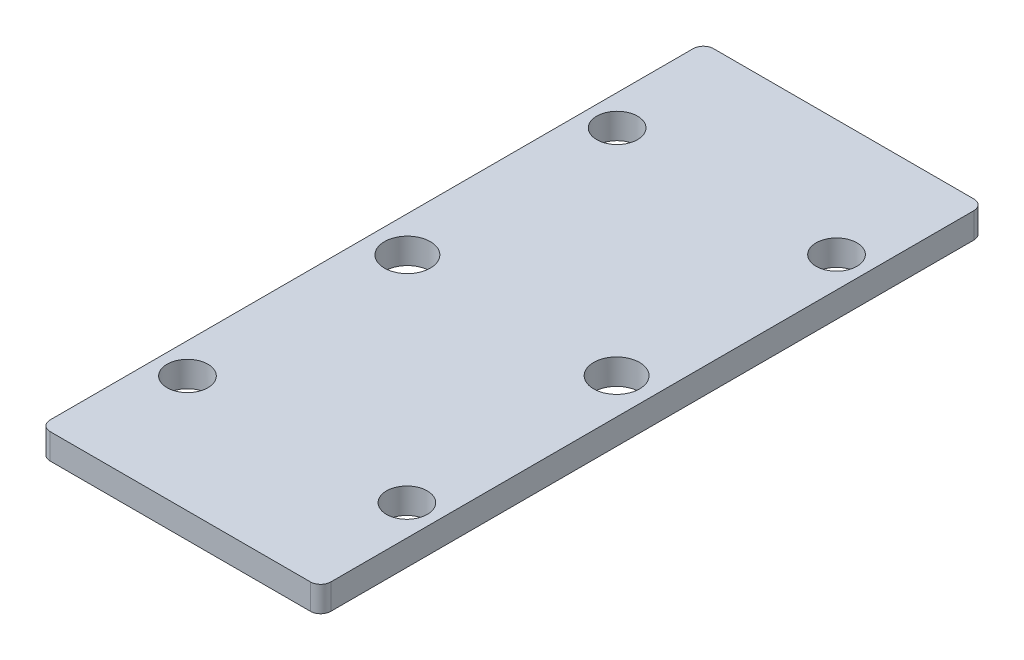
ISO-10303-21;
HEADER;
FILE_DESCRIPTION(('STEP AP214'),'2;1');
FILE_NAME('part.step','',(''),(''),'','','');
FILE_SCHEMA(('AUTOMOTIVE_DESIGN { 1 0 10303 214 1 1 1 1 }'));
ENDSEC;
DATA;
#1=APPLICATION_CONTEXT('core data for automotive mechanical design processes');
#2=APPLICATION_PROTOCOL_DEFINITION('international standard','automotive_design',2000,#1);
#3=PRODUCT_CONTEXT('',#1,'mechanical');
#4=PRODUCT('Part','Part','',(#3));
#5=PRODUCT_RELATED_PRODUCT_CATEGORY('part','',(#4));
#6=PRODUCT_DEFINITION_FORMATION('','',#4);
#7=PRODUCT_DEFINITION_CONTEXT('part definition',#1,'design');
#8=PRODUCT_DEFINITION('design','',#6,#7);
#9=PRODUCT_DEFINITION_SHAPE('','',#8);
#10=(LENGTH_UNIT() NAMED_UNIT(*) SI_UNIT(.MILLI.,.METRE.));
#11=(NAMED_UNIT(*) PLANE_ANGLE_UNIT() SI_UNIT($,.RADIAN.));
#12=(NAMED_UNIT(*) SI_UNIT($,.STERADIAN.) SOLID_ANGLE_UNIT());
#13=UNCERTAINTY_MEASURE_WITH_UNIT(LENGTH_MEASURE(1.E-05),#10,'distance_accuracy_value','');
#14=(GEOMETRIC_REPRESENTATION_CONTEXT(3) GLOBAL_UNCERTAINTY_ASSIGNED_CONTEXT((#13)) GLOBAL_UNIT_ASSIGNED_CONTEXT((#10,
#11,#12)) REPRESENTATION_CONTEXT('',''));
#15=CARTESIAN_POINT('',(0.,0.,0.));
#16=DIRECTION('',(0.,0.,1.));
#17=DIRECTION('',(1.,0.,0.));
#18=AXIS2_PLACEMENT_3D('',#15,#16,#17);
#19=CARTESIAN_POINT('',(25.5,5.,63.));
#20=DIRECTION('',(0.,-1.,0.));
#21=DIRECTION('',(0.,0.,-1.));
#22=AXIS2_PLACEMENT_3D('',#19,#20,#21);
#23=CYLINDRICAL_SURFACE('',#22,1.99999999999999);
#24=CARTESIAN_POINT('',(25.5,0.,63.));
#25=DIRECTION('',(0.,1.,0.));
#26=DIRECTION('',(0.,0.,1.));
#27=AXIS2_PLACEMENT_3D('',#24,#25,#26);
#28=CIRCLE('',#27,1.99999999999999);
#29=CARTESIAN_POINT('',(25.5,0.,65.));
#30=VERTEX_POINT('',#29);
#31=CARTESIAN_POINT('',(27.5,0.,63.));
#32=VERTEX_POINT('',#31);
#33=EDGE_CURVE('E130',#30,#32,#28,.T.);
#34=ORIENTED_EDGE('',*,*,#33,.T.);
#35=DIRECTION('',(0.,-1.,0.));
#36=VECTOR('',#35,1.);
#37=CARTESIAN_POINT('',(27.5,5.,63.));
#38=LINE('',#37,#36);
#39=CARTESIAN_POINT('',(27.5,5.,63.));
#40=VERTEX_POINT('',#39);
#41=EDGE_CURVE('E11',#40,#32,#38,.T.);
#42=ORIENTED_EDGE('',*,*,#41,.F.);
#43=CARTESIAN_POINT('',(25.5,5.,63.));
#44=DIRECTION('',(0.,1.,0.));
#45=DIRECTION('',(0.,0.,1.));
#46=AXIS2_PLACEMENT_3D('',#43,#44,#45);
#47=CIRCLE('',#46,1.99999999999999);
#48=CARTESIAN_POINT('',(25.5,5.,65.));
#49=VERTEX_POINT('',#48);
#50=EDGE_CURVE('E144',#49,#40,#47,.T.);
#51=ORIENTED_EDGE('',*,*,#50,.F.);
#52=DIRECTION('',(0.,-1.,0.));
#53=VECTOR('',#52,1.);
#54=CARTESIAN_POINT('',(25.5,5.,65.));
#55=LINE('',#54,#53);
#56=EDGE_CURVE('E126',#49,#30,#55,.T.);
#57=ORIENTED_EDGE('',*,*,#56,.T.);
#58=EDGE_LOOP('',(#34,#42,#51,#57));
#59=FACE_BOUND('',#58,.T.);
#60=ADVANCED_FACE('F32',(#59),#23,.T.);
#61=CARTESIAN_POINT('',(27.5,5.,-63.));
#62=DIRECTION('',(-1.,0.,0.));
#63=DIRECTION('',(0.,0.,1.));
#64=AXIS2_PLACEMENT_3D('',#61,#62,#63);
#65=PLANE('',#64);
#66=DIRECTION('',(0.,0.,-1.));
#67=VECTOR('',#66,1.);
#68=CARTESIAN_POINT('',(27.5,0.,-63.));
#69=LINE('',#68,#67);
#70=CARTESIAN_POINT('',(27.5,0.,-63.));
#71=VERTEX_POINT('',#70);
#72=EDGE_CURVE('E133',#32,#71,#69,.T.);
#73=ORIENTED_EDGE('',*,*,#72,.T.);
#74=DIRECTION('',(0.,-1.,0.));
#75=VECTOR('',#74,1.);
#76=CARTESIAN_POINT('',(27.5,5.,-63.));
#77=LINE('',#76,#75);
#78=CARTESIAN_POINT('',(27.5,5.,-63.));
#79=VERTEX_POINT('',#78);
#80=EDGE_CURVE('E41',#79,#71,#77,.T.);
#81=ORIENTED_EDGE('',*,*,#80,.F.);
#82=DIRECTION('',(0.,0.,-1.));
#83=VECTOR('',#82,1.);
#84=CARTESIAN_POINT('',(27.5,5.,-63.));
#85=LINE('',#84,#83);
#86=EDGE_CURVE('E93',#40,#79,#85,.T.);
#87=ORIENTED_EDGE('',*,*,#86,.F.);
#88=ORIENTED_EDGE('',*,*,#41,.T.);
#89=EDGE_LOOP('',(#73,#81,#87,#88));
#90=FACE_BOUND('',#89,.T.);
#91=ADVANCED_FACE('F191',(#90),#65,.F.);
#92=CARTESIAN_POINT('',(25.5,5.,-63.));
#93=DIRECTION('',(0.,-1.,0.));
#94=DIRECTION('',(0.,0.,-1.));
#95=AXIS2_PLACEMENT_3D('',#92,#93,#94);
#96=CYLINDRICAL_SURFACE('',#95,1.99999999999999);
#97=CARTESIAN_POINT('',(25.5,0.,-63.));
#98=DIRECTION('',(0.,1.,0.));
#99=DIRECTION('',(0.,0.,-1.));
#100=AXIS2_PLACEMENT_3D('',#97,#98,#99);
#101=CIRCLE('',#100,1.99999999999999);
#102=CARTESIAN_POINT('',(25.5,0.,-65.));
#103=VERTEX_POINT('',#102);
#104=EDGE_CURVE('E135',#71,#103,#101,.T.);
#105=ORIENTED_EDGE('',*,*,#104,.T.);
#106=DIRECTION('',(0.,-1.,0.));
#107=VECTOR('',#106,1.);
#108=CARTESIAN_POINT('',(25.5,5.,-65.));
#109=LINE('',#108,#107);
#110=CARTESIAN_POINT('',(25.5,5.,-65.));
#111=VERTEX_POINT('',#110);
#112=EDGE_CURVE('E151',#111,#103,#109,.T.);
#113=ORIENTED_EDGE('',*,*,#112,.F.);
#114=CARTESIAN_POINT('',(25.5,5.,-63.));
#115=DIRECTION('',(0.,1.,0.));
#116=DIRECTION('',(0.,0.,-1.));
#117=AXIS2_PLACEMENT_3D('',#114,#115,#116);
#118=CIRCLE('',#117,1.99999999999999);
#119=EDGE_CURVE('E206',#79,#111,#118,.T.);
#120=ORIENTED_EDGE('',*,*,#119,.F.);
#121=ORIENTED_EDGE('',*,*,#80,.T.);
#122=EDGE_LOOP('',(#105,#113,#120,#121));
#123=FACE_BOUND('',#122,.T.);
#124=ADVANCED_FACE('F196',(#123),#96,.T.);
#125=CARTESIAN_POINT('',(-25.5,5.,-65.));
#126=DIRECTION('',(0.,0.,1.));
#127=DIRECTION('',(1.,0.,0.));
#128=AXIS2_PLACEMENT_3D('',#125,#126,#127);
#129=PLANE('',#128);
#130=DIRECTION('',(-1.,0.,0.));
#131=VECTOR('',#130,1.);
#132=CARTESIAN_POINT('',(-25.5,0.,-65.));
#133=LINE('',#132,#131);
#134=CARTESIAN_POINT('',(-25.5,0.,-65.));
#135=VERTEX_POINT('',#134);
#136=EDGE_CURVE('E137',#103,#135,#133,.T.);
#137=ORIENTED_EDGE('',*,*,#136,.T.);
#138=DIRECTION('',(0.,-1.,0.));
#139=VECTOR('',#138,1.);
#140=CARTESIAN_POINT('',(-25.5,5.,-65.));
#141=LINE('',#140,#139);
#142=CARTESIAN_POINT('',(-25.5,5.,-65.));
#143=VERTEX_POINT('',#142);
#144=EDGE_CURVE('E148',#143,#135,#141,.T.);
#145=ORIENTED_EDGE('',*,*,#144,.F.);
#146=DIRECTION('',(-1.,0.,0.));
#147=VECTOR('',#146,1.);
#148=CARTESIAN_POINT('',(-25.5,5.,-65.));
#149=LINE('',#148,#147);
#150=EDGE_CURVE('E208',#111,#143,#149,.T.);
#151=ORIENTED_EDGE('',*,*,#150,.F.);
#152=ORIENTED_EDGE('',*,*,#112,.T.);
#153=EDGE_LOOP('',(#137,#145,#151,#152));
#154=FACE_BOUND('',#153,.T.);
#155=ADVANCED_FACE('F261',(#154),#129,.F.);
#156=CARTESIAN_POINT('',(-25.5,5.,-63.));
#157=DIRECTION('',(0.,-1.,0.));
#158=DIRECTION('',(0.,0.,-1.));
#159=AXIS2_PLACEMENT_3D('',#156,#157,#158);
#160=CYLINDRICAL_SURFACE('',#159,1.99999999999999);
#161=CARTESIAN_POINT('',(-25.5,0.,-63.));
#162=DIRECTION('',(0.,1.,0.));
#163=DIRECTION('',(0.,0.,-1.));
#164=AXIS2_PLACEMENT_3D('',#161,#162,#163);
#165=CIRCLE('',#164,1.99999999999999);
#166=CARTESIAN_POINT('',(-27.5,0.,-63.));
#167=VERTEX_POINT('',#166);
#168=EDGE_CURVE('E139',#135,#167,#165,.T.);
#169=ORIENTED_EDGE('',*,*,#168,.T.);
#170=DIRECTION('',(0.,-1.,0.));
#171=VECTOR('',#170,1.);
#172=CARTESIAN_POINT('',(-27.5,5.,-63.));
#173=LINE('',#172,#171);
#174=CARTESIAN_POINT('',(-27.5,5.,-63.));
#175=VERTEX_POINT('',#174);
#176=EDGE_CURVE('E121',#175,#167,#173,.T.);
#177=ORIENTED_EDGE('',*,*,#176,.F.);
#178=CARTESIAN_POINT('',(-25.5,5.,-63.));
#179=DIRECTION('',(0.,1.,0.));
#180=DIRECTION('',(0.,0.,-1.));
#181=AXIS2_PLACEMENT_3D('',#178,#179,#180);
#182=CIRCLE('',#181,1.99999999999999);
#183=EDGE_CURVE('E112',#143,#175,#182,.T.);
#184=ORIENTED_EDGE('',*,*,#183,.F.);
#185=ORIENTED_EDGE('',*,*,#144,.T.);
#186=EDGE_LOOP('',(#169,#177,#184,#185));
#187=FACE_BOUND('',#186,.T.);
#188=ADVANCED_FACE('F258',(#187),#160,.T.);
#189=CARTESIAN_POINT('',(-27.5,5.,63.));
#190=DIRECTION('',(1.,0.,0.));
#191=DIRECTION('',(0.,0.,-1.));
#192=AXIS2_PLACEMENT_3D('',#189,#190,#191);
#193=PLANE('',#192);
#194=DIRECTION('',(0.,0.,1.));
#195=VECTOR('',#194,1.);
#196=CARTESIAN_POINT('',(-27.5,0.,63.));
#197=LINE('',#196,#195);
#198=CARTESIAN_POINT('',(-27.5,0.,63.));
#199=VERTEX_POINT('',#198);
#200=EDGE_CURVE('E120',#167,#199,#197,.T.);
#201=ORIENTED_EDGE('',*,*,#200,.T.);
#202=DIRECTION('',(0.,-1.,0.));
#203=VECTOR('',#202,1.);
#204=CARTESIAN_POINT('',(-27.5,5.,63.));
#205=LINE('',#204,#203);
#206=CARTESIAN_POINT('',(-27.5,5.,63.));
#207=VERTEX_POINT('',#206);
#208=EDGE_CURVE('E117',#207,#199,#205,.T.);
#209=ORIENTED_EDGE('',*,*,#208,.F.);
#210=DIRECTION('',(0.,0.,1.));
#211=VECTOR('',#210,1.);
#212=CARTESIAN_POINT('',(-27.5,5.,63.));
#213=LINE('',#212,#211);
#214=EDGE_CURVE('E106',#175,#207,#213,.T.);
#215=ORIENTED_EDGE('',*,*,#214,.F.);
#216=ORIENTED_EDGE('',*,*,#176,.T.);
#217=EDGE_LOOP('',(#201,#209,#215,#216));
#218=FACE_BOUND('',#217,.T.);
#219=ADVANCED_FACE('F118',(#218),#193,.F.);
#220=CARTESIAN_POINT('',(-25.5,5.,63.));
#221=DIRECTION('',(0.,-1.,0.));
#222=DIRECTION('',(0.,0.,-1.));
#223=AXIS2_PLACEMENT_3D('',#220,#221,#222);
#224=CYLINDRICAL_SURFACE('',#223,1.99999999999999);
#225=CARTESIAN_POINT('',(-25.5,0.,63.));
#226=DIRECTION('',(0.,1.,0.));
#227=DIRECTION('',(0.,0.,-1.));
#228=AXIS2_PLACEMENT_3D('',#225,#226,#227);
#229=CIRCLE('',#228,1.99999999999999);
#230=CARTESIAN_POINT('',(-25.5,0.,65.));
#231=VERTEX_POINT('',#230);
#232=EDGE_CURVE('E79',#199,#231,#229,.T.);
#233=ORIENTED_EDGE('',*,*,#232,.T.);
#234=DIRECTION('',(0.,-1.,0.));
#235=VECTOR('',#234,1.);
#236=CARTESIAN_POINT('',(-25.5,5.,65.));
#237=LINE('',#236,#235);
#238=CARTESIAN_POINT('',(-25.5,5.,65.));
#239=VERTEX_POINT('',#238);
#240=EDGE_CURVE('E122',#239,#231,#237,.T.);
#241=ORIENTED_EDGE('',*,*,#240,.F.);
#242=CARTESIAN_POINT('',(-25.5,5.,63.));
#243=DIRECTION('',(0.,1.,0.));
#244=DIRECTION('',(0.,0.,-1.));
#245=AXIS2_PLACEMENT_3D('',#242,#243,#244);
#246=CIRCLE('',#245,1.99999999999999);
#247=EDGE_CURVE('E110',#207,#239,#246,.T.);
#248=ORIENTED_EDGE('',*,*,#247,.F.);
#249=ORIENTED_EDGE('',*,*,#208,.T.);
#250=EDGE_LOOP('',(#233,#241,#248,#249));
#251=FACE_BOUND('',#250,.T.);
#252=ADVANCED_FACE('F124',(#251),#224,.T.);
#253=CARTESIAN_POINT('',(-25.5,5.,65.));
#254=DIRECTION('',(0.,0.,-1.));
#255=DIRECTION('',(-1.,0.,0.));
#256=AXIS2_PLACEMENT_3D('',#253,#254,#255);
#257=PLANE('',#256);
#258=DIRECTION('',(1.,0.,0.));
#259=VECTOR('',#258,1.);
#260=CARTESIAN_POINT('',(-25.5,0.,65.));
#261=LINE('',#260,#259);
#262=EDGE_CURVE('E85',#231,#30,#261,.T.);
#263=ORIENTED_EDGE('',*,*,#262,.T.);
#264=ORIENTED_EDGE('',*,*,#56,.F.);
#265=DIRECTION('',(1.,0.,0.));
#266=VECTOR('',#265,1.);
#267=CARTESIAN_POINT('',(-25.5,5.,65.));
#268=LINE('',#267,#266);
#269=EDGE_CURVE('E50',#239,#49,#268,.T.);
#270=ORIENTED_EDGE('',*,*,#269,.F.);
#271=ORIENTED_EDGE('',*,*,#240,.T.);
#272=EDGE_LOOP('',(#263,#264,#270,#271));
#273=FACE_BOUND('',#272,.T.);
#274=ADVANCED_FACE('F236',(#273),#257,.F.);
#275=CARTESIAN_POINT('',(25.5,5.,63.));
#276=DIRECTION('',(0.,1.,0.));
#277=DIRECTION('',(0.,0.,1.));
#278=AXIS2_PLACEMENT_3D('',#275,#276,#277);
#279=PLANE('',#278);
#280=CARTESIAN_POINT('',(21.5,5.,-42.1));
#281=DIRECTION('',(0.,1.,0.));
#282=DIRECTION('',(0.,0.,-1.));
#283=AXIS2_PLACEMENT_3D('',#280,#281,#282);
#284=CIRCLE('',#283,3.99999999999999);
#285=CARTESIAN_POINT('',(21.5,5.,-46.1));
#286=VERTEX_POINT('',#285);
#287=EDGE_CURVE('E223',#286,#286,#284,.T.);
#288=ORIENTED_EDGE('',*,*,#287,.F.);
#289=EDGE_LOOP('',(#288));
#290=FACE_BOUND('',#289,.T.);
#291=CARTESIAN_POINT('',(-21.5,5.,42.1));
#292=DIRECTION('',(0.,1.,0.));
#293=DIRECTION('',(0.,0.,-1.));
#294=AXIS2_PLACEMENT_3D('',#291,#292,#293);
#295=CIRCLE('',#294,3.99999999999999);
#296=CARTESIAN_POINT('',(-21.5,5.,38.1));
#297=VERTEX_POINT('',#296);
#298=EDGE_CURVE('E220',#297,#297,#295,.T.);
#299=ORIENTED_EDGE('',*,*,#298,.F.);
#300=EDGE_LOOP('',(#299));
#301=FACE_BOUND('',#300,.T.);
#302=CARTESIAN_POINT('',(-21.5,5.,-42.1));
#303=DIRECTION('',(0.,1.,0.));
#304=DIRECTION('',(0.,0.,1.));
#305=AXIS2_PLACEMENT_3D('',#302,#303,#304);
#306=CIRCLE('',#305,3.99999999999999);
#307=CARTESIAN_POINT('',(-21.5,5.,-38.1));
#308=VERTEX_POINT('',#307);
#309=EDGE_CURVE('E217',#308,#308,#306,.T.);
#310=ORIENTED_EDGE('',*,*,#309,.F.);
#311=EDGE_LOOP('',(#310));
#312=FACE_BOUND('',#311,.T.);
#313=CARTESIAN_POINT('',(20.5,5.,0.));
#314=DIRECTION('',(0.,1.,0.));
#315=DIRECTION('',(0.,0.,-1.));
#316=AXIS2_PLACEMENT_3D('',#313,#314,#315);
#317=CIRCLE('',#316,4.5);
#318=CARTESIAN_POINT('',(20.5,5.,-4.5));
#319=VERTEX_POINT('',#318);
#320=EDGE_CURVE('E216',#319,#319,#317,.T.);
#321=ORIENTED_EDGE('',*,*,#320,.F.);
#322=EDGE_LOOP('',(#321));
#323=FACE_BOUND('',#322,.T.);
#324=CARTESIAN_POINT('',(21.5,5.,42.1));
#325=DIRECTION('',(0.,1.,0.));
#326=DIRECTION('',(0.,0.,1.));
#327=AXIS2_PLACEMENT_3D('',#324,#325,#326);
#328=CIRCLE('',#327,3.99999999999999);
#329=CARTESIAN_POINT('',(21.5,5.,46.1));
#330=VERTEX_POINT('',#329);
#331=EDGE_CURVE('E225',#330,#330,#328,.T.);
#332=ORIENTED_EDGE('',*,*,#331,.F.);
#333=EDGE_LOOP('',(#332));
#334=FACE_BOUND('',#333,.T.);
#335=CARTESIAN_POINT('',(-20.5,5.,0.));
#336=DIRECTION('',(0.,1.,0.));
#337=DIRECTION('',(0.,0.,1.));
#338=AXIS2_PLACEMENT_3D('',#335,#336,#337);
#339=CIRCLE('',#338,4.5);
#340=CARTESIAN_POINT('',(-20.5,5.,4.5));
#341=VERTEX_POINT('',#340);
#342=EDGE_CURVE('E160',#341,#341,#339,.T.);
#343=ORIENTED_EDGE('',*,*,#342,.F.);
#344=EDGE_LOOP('',(#343));
#345=FACE_BOUND('',#344,.T.);
#346=ORIENTED_EDGE('',*,*,#50,.T.);
#347=ORIENTED_EDGE('',*,*,#86,.T.);
#348=ORIENTED_EDGE('',*,*,#119,.T.);
#349=ORIENTED_EDGE('',*,*,#150,.T.);
#350=ORIENTED_EDGE('',*,*,#183,.T.);
#351=ORIENTED_EDGE('',*,*,#214,.T.);
#352=ORIENTED_EDGE('',*,*,#247,.T.);
#353=ORIENTED_EDGE('',*,*,#269,.T.);
#354=EDGE_LOOP('',(#346,#347,#348,#349,#350,#351,#352,#353));
#355=FACE_BOUND('',#354,.T.);
#356=ADVANCED_FACE('F108',(#290,#301,#312,#323,#334,#345,#355),#279,.T.);
#357=CARTESIAN_POINT('',(25.5,0.,63.));
#358=DIRECTION('',(0.,1.,0.));
#359=DIRECTION('',(0.,0.,1.));
#360=AXIS2_PLACEMENT_3D('',#357,#358,#359);
#361=PLANE('',#360);
#362=CARTESIAN_POINT('',(21.5,0.,-42.1));
#363=DIRECTION('',(0.,1.,0.));
#364=DIRECTION('',(0.,0.,1.));
#365=AXIS2_PLACEMENT_3D('',#362,#363,#364);
#366=CIRCLE('',#365,3.99999999999999);
#367=CARTESIAN_POINT('',(21.5,0.,-38.1));
#368=VERTEX_POINT('',#367);
#369=EDGE_CURVE('E35',#368,#368,#366,.T.);
#370=ORIENTED_EDGE('',*,*,#369,.T.);
#371=EDGE_LOOP('',(#370));
#372=FACE_BOUND('',#371,.T.);
#373=CARTESIAN_POINT('',(-21.5,0.,42.1));
#374=DIRECTION('',(0.,1.,0.));
#375=DIRECTION('',(0.,0.,1.));
#376=AXIS2_PLACEMENT_3D('',#373,#374,#375);
#377=CIRCLE('',#376,3.99999999999999);
#378=CARTESIAN_POINT('',(-21.5,0.,46.1));
#379=VERTEX_POINT('',#378);
#380=EDGE_CURVE('E168',#379,#379,#377,.T.);
#381=ORIENTED_EDGE('',*,*,#380,.T.);
#382=EDGE_LOOP('',(#381));
#383=FACE_BOUND('',#382,.T.);
#384=CARTESIAN_POINT('',(-21.5,0.,-42.1));
#385=DIRECTION('',(0.,1.,0.));
#386=DIRECTION('',(0.,0.,1.));
#387=AXIS2_PLACEMENT_3D('',#384,#385,#386);
#388=CIRCLE('',#387,3.99999999999999);
#389=CARTESIAN_POINT('',(-21.5,0.,-38.1));
#390=VERTEX_POINT('',#389);
#391=EDGE_CURVE('E166',#390,#390,#388,.T.);
#392=ORIENTED_EDGE('',*,*,#391,.T.);
#393=EDGE_LOOP('',(#392));
#394=FACE_BOUND('',#393,.T.);
#395=CARTESIAN_POINT('',(20.5,0.,0.));
#396=DIRECTION('',(0.,1.,0.));
#397=DIRECTION('',(0.,0.,1.));
#398=AXIS2_PLACEMENT_3D('',#395,#396,#397);
#399=CIRCLE('',#398,4.5);
#400=CARTESIAN_POINT('',(20.5,0.,4.5));
#401=VERTEX_POINT('',#400);
#402=EDGE_CURVE('E163',#401,#401,#399,.T.);
#403=ORIENTED_EDGE('',*,*,#402,.T.);
#404=EDGE_LOOP('',(#403));
#405=FACE_BOUND('',#404,.T.);
#406=CARTESIAN_POINT('',(21.5,0.,42.1));
#407=DIRECTION('',(0.,1.,0.));
#408=DIRECTION('',(0.,0.,1.));
#409=AXIS2_PLACEMENT_3D('',#406,#407,#408);
#410=CIRCLE('',#409,3.99999999999999);
#411=CARTESIAN_POINT('',(21.5,0.,46.1));
#412=VERTEX_POINT('',#411);
#413=EDGE_CURVE('E159',#412,#412,#410,.T.);
#414=ORIENTED_EDGE('',*,*,#413,.T.);
#415=EDGE_LOOP('',(#414));
#416=FACE_BOUND('',#415,.T.);
#417=CARTESIAN_POINT('',(-20.5,0.,0.));
#418=DIRECTION('',(0.,1.,0.));
#419=DIRECTION('',(0.,0.,1.));
#420=AXIS2_PLACEMENT_3D('',#417,#418,#419);
#421=CIRCLE('',#420,4.5);
#422=CARTESIAN_POINT('',(-20.5,0.,4.5));
#423=VERTEX_POINT('',#422);
#424=EDGE_CURVE('E156',#423,#423,#421,.T.);
#425=ORIENTED_EDGE('',*,*,#424,.T.);
#426=EDGE_LOOP('',(#425));
#427=FACE_BOUND('',#426,.T.);
#428=ORIENTED_EDGE('',*,*,#33,.F.);
#429=ORIENTED_EDGE('',*,*,#262,.F.);
#430=ORIENTED_EDGE('',*,*,#232,.F.);
#431=ORIENTED_EDGE('',*,*,#200,.F.);
#432=ORIENTED_EDGE('',*,*,#168,.F.);
#433=ORIENTED_EDGE('',*,*,#136,.F.);
#434=ORIENTED_EDGE('',*,*,#104,.F.);
#435=ORIENTED_EDGE('',*,*,#72,.F.);
#436=EDGE_LOOP('',(#428,#429,#430,#431,#432,#433,#434,#435));
#437=FACE_BOUND('',#436,.T.);
#438=ADVANCED_FACE('F175',(#372,#383,#394,#405,#416,#427,#437),#361,.F.);
#439=CARTESIAN_POINT('',(-20.5,-5.,0.));
#440=DIRECTION('',(0.,1.,0.));
#441=DIRECTION('',(0.,0.,1.));
#442=AXIS2_PLACEMENT_3D('',#439,#440,#441);
#443=CYLINDRICAL_SURFACE('',#442,4.5);
#444=ORIENTED_EDGE('',*,*,#342,.T.);
#445=EDGE_LOOP('',(#444));
#446=FACE_BOUND('',#445,.T.);
#447=ORIENTED_EDGE('',*,*,#424,.F.);
#448=EDGE_LOOP('',(#447));
#449=FACE_BOUND('',#448,.T.);
#450=ADVANCED_FACE('F241',(#446,#449),#443,.F.);
#451=CARTESIAN_POINT('',(21.5,-5.,42.1));
#452=DIRECTION('',(0.,1.,0.));
#453=DIRECTION('',(0.,0.,1.));
#454=AXIS2_PLACEMENT_3D('',#451,#452,#453);
#455=CYLINDRICAL_SURFACE('',#454,3.99999999999999);
#456=ORIENTED_EDGE('',*,*,#331,.T.);
#457=EDGE_LOOP('',(#456));
#458=FACE_BOUND('',#457,.T.);
#459=ORIENTED_EDGE('',*,*,#413,.F.);
#460=EDGE_LOOP('',(#459));
#461=FACE_BOUND('',#460,.T.);
#462=ADVANCED_FACE('F231',(#458,#461),#455,.F.);
#463=CARTESIAN_POINT('',(20.5,-5.,0.));
#464=DIRECTION('',(0.,1.,0.));
#465=DIRECTION('',(0.,0.,1.));
#466=AXIS2_PLACEMENT_3D('',#463,#464,#465);
#467=CYLINDRICAL_SURFACE('',#466,4.5);
#468=ORIENTED_EDGE('',*,*,#320,.T.);
#469=EDGE_LOOP('',(#468));
#470=FACE_BOUND('',#469,.T.);
#471=ORIENTED_EDGE('',*,*,#402,.F.);
#472=EDGE_LOOP('',(#471));
#473=FACE_BOUND('',#472,.T.);
#474=ADVANCED_FACE('F314',(#470,#473),#467,.F.);
#475=CARTESIAN_POINT('',(-21.5,-5.,-42.1));
#476=DIRECTION('',(0.,1.,0.));
#477=DIRECTION('',(0.,0.,1.));
#478=AXIS2_PLACEMENT_3D('',#475,#476,#477);
#479=CYLINDRICAL_SURFACE('',#478,3.99999999999999);
#480=ORIENTED_EDGE('',*,*,#309,.T.);
#481=EDGE_LOOP('',(#480));
#482=FACE_BOUND('',#481,.T.);
#483=ORIENTED_EDGE('',*,*,#391,.F.);
#484=EDGE_LOOP('',(#483));
#485=FACE_BOUND('',#484,.T.);
#486=ADVANCED_FACE('F185',(#482,#485),#479,.F.);
#487=CARTESIAN_POINT('',(-21.5,-5.,42.1));
#488=DIRECTION('',(0.,1.,0.));
#489=DIRECTION('',(0.,0.,1.));
#490=AXIS2_PLACEMENT_3D('',#487,#488,#489);
#491=CYLINDRICAL_SURFACE('',#490,3.99999999999999);
#492=ORIENTED_EDGE('',*,*,#298,.T.);
#493=EDGE_LOOP('',(#492));
#494=FACE_BOUND('',#493,.T.);
#495=ORIENTED_EDGE('',*,*,#380,.F.);
#496=EDGE_LOOP('',(#495));
#497=FACE_BOUND('',#496,.T.);
#498=ADVANCED_FACE('F179',(#494,#497),#491,.F.);
#499=CARTESIAN_POINT('',(21.5,-5.,-42.1));
#500=DIRECTION('',(0.,1.,0.));
#501=DIRECTION('',(0.,0.,1.));
#502=AXIS2_PLACEMENT_3D('',#499,#500,#501);
#503=CYLINDRICAL_SURFACE('',#502,3.99999999999999);
#504=ORIENTED_EDGE('',*,*,#287,.T.);
#505=EDGE_LOOP('',(#504));
#506=FACE_BOUND('',#505,.T.);
#507=ORIENTED_EDGE('',*,*,#369,.F.);
#508=EDGE_LOOP('',(#507));
#509=FACE_BOUND('',#508,.T.);
#510=ADVANCED_FACE('F177',(#506,#509),#503,.F.);
#511=CLOSED_SHELL('',(#60,#91,#124,#155,#188,#219,#252,#274,#356,#438,#450,#462,#474,#486,#498,#510));
#512=MANIFOLD_SOLID_BREP('B2',#511);
#513=ADVANCED_BREP_SHAPE_REPRESENTATION('',(#18,#512),#14);
#514=SHAPE_DEFINITION_REPRESENTATION(#9,#513);
ENDSEC;
END-ISO-10303-21;
